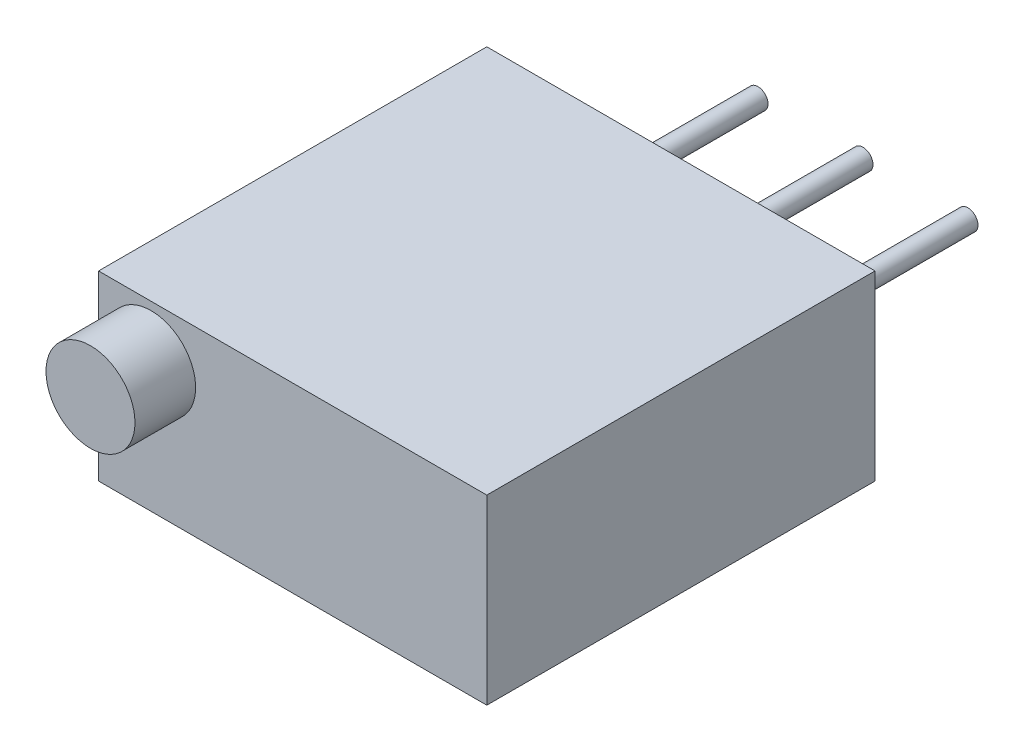
ISO-10303-21;
HEADER;
FILE_DESCRIPTION(('STEP AP214'),'2;1');
FILE_NAME('part.step','',(''),(''),'','','');
FILE_SCHEMA(('AUTOMOTIVE_DESIGN { 1 0 10303 214 1 1 1 1 }'));
ENDSEC;
DATA;
#1=APPLICATION_CONTEXT('core data for automotive mechanical design processes');
#2=APPLICATION_PROTOCOL_DEFINITION('international standard','automotive_design',2000,#1);
#3=PRODUCT_CONTEXT('',#1,'mechanical');
#4=PRODUCT('Part','Part','',(#3));
#5=PRODUCT_RELATED_PRODUCT_CATEGORY('part','',(#4));
#6=PRODUCT_DEFINITION_FORMATION('','',#4);
#7=PRODUCT_DEFINITION_CONTEXT('part definition',#1,'design');
#8=PRODUCT_DEFINITION('design','',#6,#7);
#9=PRODUCT_DEFINITION_SHAPE('','',#8);
#10=(LENGTH_UNIT() NAMED_UNIT(*) SI_UNIT(.MILLI.,.METRE.));
#11=(NAMED_UNIT(*) PLANE_ANGLE_UNIT() SI_UNIT($,.RADIAN.));
#12=(NAMED_UNIT(*) SI_UNIT($,.STERADIAN.) SOLID_ANGLE_UNIT());
#13=UNCERTAINTY_MEASURE_WITH_UNIT(LENGTH_MEASURE(1.E-05),#10,'distance_accuracy_value','');
#14=(GEOMETRIC_REPRESENTATION_CONTEXT(3) GLOBAL_UNCERTAINTY_ASSIGNED_CONTEXT((#13)) GLOBAL_UNIT_ASSIGNED_CONTEXT((#10,
#11,#12)) REPRESENTATION_CONTEXT('',''));
#15=CARTESIAN_POINT('',(0.,0.,0.));
#16=DIRECTION('',(0.,0.,1.));
#17=DIRECTION('',(1.,0.,0.));
#18=AXIS2_PLACEMENT_3D('',#15,#16,#17);
#19=CARTESIAN_POINT('',(-4.79999999999999,4.5,4.79999999999999));
#20=DIRECTION('',(0.,0.,-1.));
#21=DIRECTION('',(-1.,0.,0.));
#22=AXIS2_PLACEMENT_3D('',#19,#20,#21);
#23=PLANE('',#22);
#24=DIRECTION('',(1.,0.,0.));
#25=VECTOR('',#24,1.);
#26=CARTESIAN_POINT('',(-4.79999999999999,0.,4.79999999999999));
#27=LINE('',#26,#25);
#28=CARTESIAN_POINT('',(-4.79999999999999,0.,4.79999999999999));
#29=VERTEX_POINT('',#28);
#30=CARTESIAN_POINT('',(4.80000000000001,0.,4.79999999999999));
#31=VERTEX_POINT('',#30);
#32=EDGE_CURVE('E78',#29,#31,#27,.T.);
#33=ORIENTED_EDGE('',*,*,#32,.T.);
#34=DIRECTION('',(0.,-1.,0.));
#35=VECTOR('',#34,1.);
#36=CARTESIAN_POINT('',(4.80000000000001,4.5,4.79999999999999));
#37=LINE('',#36,#35);
#38=CARTESIAN_POINT('',(4.80000000000001,4.5,4.79999999999999));
#39=VERTEX_POINT('',#38);
#40=EDGE_CURVE('E96',#39,#31,#37,.T.);
#41=ORIENTED_EDGE('',*,*,#40,.F.);
#42=DIRECTION('',(1.,0.,0.));
#43=VECTOR('',#42,1.);
#44=CARTESIAN_POINT('',(-4.79999999999999,4.5,4.79999999999999));
#45=LINE('',#44,#43);
#46=CARTESIAN_POINT('',(-4.79999999999999,4.5,4.79999999999999));
#47=VERTEX_POINT('',#46);
#48=EDGE_CURVE('E92',#47,#39,#45,.T.);
#49=ORIENTED_EDGE('',*,*,#48,.F.);
#50=DIRECTION('',(0.,-1.,0.));
#51=VECTOR('',#50,1.);
#52=CARTESIAN_POINT('',(-4.79999999999999,4.5,4.79999999999999));
#53=LINE('',#52,#51);
#54=EDGE_CURVE('E90',#47,#29,#53,.T.);
#55=ORIENTED_EDGE('',*,*,#54,.T.);
#56=EDGE_LOOP('',(#33,#41,#49,#55));
#57=FACE_BOUND('',#56,.T.);
#58=CARTESIAN_POINT('',(-3.49999999999999,3.2,4.79999999999999));
#59=DIRECTION('',(0.,0.,-1.));
#60=DIRECTION('',(-1.,0.,0.));
#61=AXIS2_PLACEMENT_3D('',#58,#59,#60);
#62=CIRCLE('',#61,1.1);
#63=CARTESIAN_POINT('',(-4.59999999999999,3.2,4.79999999999999));
#64=VERTEX_POINT('',#63);
#65=EDGE_CURVE('E11',#64,#64,#62,.F.);
#66=ORIENTED_EDGE('',*,*,#65,.F.);
#67=EDGE_LOOP('',(#66));
#68=FACE_BOUND('',#67,.T.);
#69=ADVANCED_FACE('F37',(#57,#68),#23,.F.);
#70=CARTESIAN_POINT('',(-4.79999999999999,4.5,-4.80000000000001));
#71=DIRECTION('',(0.,0.,1.));
#72=DIRECTION('',(1.,0.,0.));
#73=AXIS2_PLACEMENT_3D('',#70,#71,#72);
#74=PLANE('',#73);
#75=CARTESIAN_POINT('',(-2.59597838181529,2.25,-4.80000000000001));
#76=DIRECTION('',(0.,0.,1.));
#77=DIRECTION('',(1.,0.,0.));
#78=AXIS2_PLACEMENT_3D('',#75,#76,#77);
#79=CIRCLE('',#78,0.25);
#80=CARTESIAN_POINT('',(-2.34597838181529,2.25,-4.80000000000001));
#81=VERTEX_POINT('',#80);
#82=EDGE_CURVE('E122',#81,#81,#79,.F.);
#83=ORIENTED_EDGE('',*,*,#82,.F.);
#84=EDGE_LOOP('',(#83));
#85=FACE_BOUND('',#84,.T.);
#86=DIRECTION('',(-1.,0.,0.));
#87=VECTOR('',#86,1.);
#88=CARTESIAN_POINT('',(-4.79999999999999,0.,-4.80000000000001));
#89=LINE('',#88,#87);
#90=CARTESIAN_POINT('',(4.80000000000001,0.,-4.80000000000001));
#91=VERTEX_POINT('',#90);
#92=CARTESIAN_POINT('',(-4.79999999999999,0.,-4.80000000000001));
#93=VERTEX_POINT('',#92);
#94=EDGE_CURVE('E108',#91,#93,#89,.T.);
#95=ORIENTED_EDGE('',*,*,#94,.T.);
#96=DIRECTION('',(0.,-1.,0.));
#97=VECTOR('',#96,1.);
#98=CARTESIAN_POINT('',(-4.79999999999999,4.5,-4.80000000000001));
#99=LINE('',#98,#97);
#100=CARTESIAN_POINT('',(-4.79999999999999,4.5,-4.80000000000001));
#101=VERTEX_POINT('',#100);
#102=EDGE_CURVE('E99',#101,#93,#99,.T.);
#103=ORIENTED_EDGE('',*,*,#102,.F.);
#104=DIRECTION('',(-1.,0.,0.));
#105=VECTOR('',#104,1.);
#106=CARTESIAN_POINT('',(-4.79999999999999,4.5,-4.80000000000001));
#107=LINE('',#106,#105);
#108=CARTESIAN_POINT('',(4.80000000000001,4.5,-4.80000000000001));
#109=VERTEX_POINT('',#108);
#110=EDGE_CURVE('E52',#109,#101,#107,.T.);
#111=ORIENTED_EDGE('',*,*,#110,.F.);
#112=DIRECTION('',(0.,-1.,0.));
#113=VECTOR('',#112,1.);
#114=CARTESIAN_POINT('',(4.80000000000001,4.5,-4.80000000000001));
#115=LINE('',#114,#113);
#116=EDGE_CURVE('E116',#109,#91,#115,.T.);
#117=ORIENTED_EDGE('',*,*,#116,.T.);
#118=EDGE_LOOP('',(#95,#103,#111,#117));
#119=FACE_BOUND('',#118,.T.);
#120=CARTESIAN_POINT('',(0.,2.25,-4.80000000000001));
#121=DIRECTION('',(0.,0.,1.));
#122=DIRECTION('',(1.,0.,0.));
#123=AXIS2_PLACEMENT_3D('',#120,#121,#122);
#124=CIRCLE('',#123,0.25);
#125=CARTESIAN_POINT('',(0.250000000000008,2.25,-4.80000000000001));
#126=VERTEX_POINT('',#125);
#127=EDGE_CURVE('E95',#126,#126,#124,.F.);
#128=ORIENTED_EDGE('',*,*,#127,.F.);
#129=EDGE_LOOP('',(#128));
#130=FACE_BOUND('',#129,.T.);
#131=CARTESIAN_POINT('',(2.5959783818153,2.25,-4.80000000000001));
#132=DIRECTION('',(0.,0.,1.));
#133=DIRECTION('',(1.,0.,0.));
#134=AXIS2_PLACEMENT_3D('',#131,#132,#133);
#135=CIRCLE('',#134,0.25);
#136=CARTESIAN_POINT('',(2.8459783818153,2.25,-4.80000000000001));
#137=VERTEX_POINT('',#136);
#138=EDGE_CURVE('E45',#137,#137,#135,.F.);
#139=ORIENTED_EDGE('',*,*,#138,.F.);
#140=EDGE_LOOP('',(#139));
#141=FACE_BOUND('',#140,.T.);
#142=ADVANCED_FACE('F129',(#85,#119,#130,#141),#74,.F.);
#143=CARTESIAN_POINT('',(-4.79999999999999,4.5,-4.80000000000001));
#144=DIRECTION('',(1.,0.,0.));
#145=DIRECTION('',(0.,0.,-1.));
#146=AXIS2_PLACEMENT_3D('',#143,#144,#145);
#147=PLANE('',#146);
#148=DIRECTION('',(0.,0.,1.));
#149=VECTOR('',#148,1.);
#150=CARTESIAN_POINT('',(-4.79999999999999,0.,-4.80000000000001));
#151=LINE('',#150,#149);
#152=EDGE_CURVE('E83',#93,#29,#151,.T.);
#153=ORIENTED_EDGE('',*,*,#152,.T.);
#154=ORIENTED_EDGE('',*,*,#54,.F.);
#155=DIRECTION('',(0.,0.,1.));
#156=VECTOR('',#155,1.);
#157=CARTESIAN_POINT('',(-4.79999999999999,4.5,-4.80000000000001));
#158=LINE('',#157,#156);
#159=EDGE_CURVE('E110',#101,#47,#158,.T.);
#160=ORIENTED_EDGE('',*,*,#159,.F.);
#161=ORIENTED_EDGE('',*,*,#102,.T.);
#162=EDGE_LOOP('',(#153,#154,#160,#161));
#163=FACE_BOUND('',#162,.T.);
#164=ADVANCED_FACE('F39',(#163),#147,.F.);
#165=CARTESIAN_POINT('',(4.80000000000001,4.5,-4.80000000000001));
#166=DIRECTION('',(-1.,0.,0.));
#167=DIRECTION('',(0.,0.,1.));
#168=AXIS2_PLACEMENT_3D('',#165,#166,#167);
#169=PLANE('',#168);
#170=DIRECTION('',(0.,0.,-1.));
#171=VECTOR('',#170,1.);
#172=CARTESIAN_POINT('',(4.80000000000001,0.,-4.80000000000001));
#173=LINE('',#172,#171);
#174=EDGE_CURVE('E84',#31,#91,#173,.T.);
#175=ORIENTED_EDGE('',*,*,#174,.T.);
#176=ORIENTED_EDGE('',*,*,#116,.F.);
#177=DIRECTION('',(0.,0.,-1.));
#178=VECTOR('',#177,1.);
#179=CARTESIAN_POINT('',(4.80000000000001,4.5,-4.80000000000001));
#180=LINE('',#179,#178);
#181=EDGE_CURVE('E57',#39,#109,#180,.T.);
#182=ORIENTED_EDGE('',*,*,#181,.F.);
#183=ORIENTED_EDGE('',*,*,#40,.T.);
#184=EDGE_LOOP('',(#175,#176,#182,#183));
#185=FACE_BOUND('',#184,.T.);
#186=ADVANCED_FACE('F137',(#185),#169,.F.);
#187=CARTESIAN_POINT('',(-4.79999999999999,4.5,-4.80000000000001));
#188=DIRECTION('',(0.,1.,0.));
#189=DIRECTION('',(0.,0.,1.));
#190=AXIS2_PLACEMENT_3D('',#187,#188,#189);
#191=PLANE('',#190);
#192=ORIENTED_EDGE('',*,*,#159,.T.);
#193=ORIENTED_EDGE('',*,*,#48,.T.);
#194=ORIENTED_EDGE('',*,*,#181,.T.);
#195=ORIENTED_EDGE('',*,*,#110,.T.);
#196=EDGE_LOOP('',(#192,#193,#194,#195));
#197=FACE_BOUND('',#196,.T.);
#198=ADVANCED_FACE('F142',(#197),#191,.T.);
#199=CARTESIAN_POINT('',(-4.79999999999999,0.,-4.80000000000001));
#200=DIRECTION('',(0.,1.,0.));
#201=DIRECTION('',(0.,0.,1.));
#202=AXIS2_PLACEMENT_3D('',#199,#200,#201);
#203=PLANE('',#202);
#204=ORIENTED_EDGE('',*,*,#152,.F.);
#205=ORIENTED_EDGE('',*,*,#94,.F.);
#206=ORIENTED_EDGE('',*,*,#174,.F.);
#207=ORIENTED_EDGE('',*,*,#32,.F.);
#208=EDGE_LOOP('',(#204,#205,#206,#207));
#209=FACE_BOUND('',#208,.T.);
#210=ADVANCED_FACE('F80',(#209),#203,.F.);
#211=CARTESIAN_POINT('',(0.,2.25,-9.3));
#212=DIRECTION('',(0.,0.,1.));
#213=DIRECTION('',(1.,0.,0.));
#214=AXIS2_PLACEMENT_3D('',#211,#212,#213);
#215=CYLINDRICAL_SURFACE('',#214,0.25);
#216=CARTESIAN_POINT('',(0.,2.25,-9.3));
#217=DIRECTION('',(0.,0.,-1.));
#218=DIRECTION('',(-1.,0.,0.));
#219=AXIS2_PLACEMENT_3D('',#216,#217,#218);
#220=CIRCLE('',#219,0.25);
#221=CARTESIAN_POINT('',(-0.249999999999992,2.25,-9.3));
#222=VERTEX_POINT('',#221);
#223=EDGE_CURVE('E100',#222,#222,#220,.T.);
#224=ORIENTED_EDGE('',*,*,#223,.F.);
#225=EDGE_LOOP('',(#224));
#226=FACE_BOUND('',#225,.T.);
#227=ORIENTED_EDGE('',*,*,#127,.T.);
#228=EDGE_LOOP('',(#227));
#229=FACE_BOUND('',#228,.T.);
#230=ADVANCED_FACE('F152',(#226,#229),#215,.T.);
#231=CARTESIAN_POINT('',(0.,2.25,-9.3));
#232=DIRECTION('',(0.,0.,-1.));
#233=DIRECTION('',(-1.,0.,0.));
#234=AXIS2_PLACEMENT_3D('',#231,#232,#233);
#235=PLANE('',#234);
#236=ORIENTED_EDGE('',*,*,#223,.T.);
#237=EDGE_LOOP('',(#236));
#238=FACE_BOUND('',#237,.T.);
#239=ADVANCED_FACE('F154',(#238),#235,.T.);
#240=CARTESIAN_POINT('',(-2.59597838181529,2.25,-9.3));
#241=DIRECTION('',(0.,0.,1.));
#242=DIRECTION('',(1.,0.,0.));
#243=AXIS2_PLACEMENT_3D('',#240,#241,#242);
#244=CYLINDRICAL_SURFACE('',#243,0.25);
#245=CARTESIAN_POINT('',(-2.59597838181529,2.25,-9.3));
#246=DIRECTION('',(0.,0.,-1.));
#247=DIRECTION('',(-1.,0.,0.));
#248=AXIS2_PLACEMENT_3D('',#245,#246,#247);
#249=CIRCLE('',#248,0.25);
#250=CARTESIAN_POINT('',(-2.84597838181529,2.25,-9.3));
#251=VERTEX_POINT('',#250);
#252=EDGE_CURVE('E103',#251,#251,#249,.T.);
#253=ORIENTED_EDGE('',*,*,#252,.F.);
#254=EDGE_LOOP('',(#253));
#255=FACE_BOUND('',#254,.T.);
#256=ORIENTED_EDGE('',*,*,#82,.T.);
#257=EDGE_LOOP('',(#256));
#258=FACE_BOUND('',#257,.T.);
#259=ADVANCED_FACE('F161',(#255,#258),#244,.T.);
#260=CARTESIAN_POINT('',(-2.59597838181529,2.25,-9.3));
#261=DIRECTION('',(0.,0.,-1.));
#262=DIRECTION('',(-1.,0.,0.));
#263=AXIS2_PLACEMENT_3D('',#260,#261,#262);
#264=PLANE('',#263);
#265=ORIENTED_EDGE('',*,*,#252,.T.);
#266=EDGE_LOOP('',(#265));
#267=FACE_BOUND('',#266,.T.);
#268=ADVANCED_FACE('F168',(#267),#264,.T.);
#269=CARTESIAN_POINT('',(2.5959783818153,2.25,-9.3));
#270=DIRECTION('',(0.,0.,1.));
#271=DIRECTION('',(1.,0.,0.));
#272=AXIS2_PLACEMENT_3D('',#269,#270,#271);
#273=CYLINDRICAL_SURFACE('',#272,0.25);
#274=CARTESIAN_POINT('',(2.5959783818153,2.25,-9.3));
#275=DIRECTION('',(0.,0.,-1.));
#276=DIRECTION('',(1.,0.,0.));
#277=AXIS2_PLACEMENT_3D('',#274,#275,#276);
#278=CIRCLE('',#277,0.25);
#279=CARTESIAN_POINT('',(2.8459783818153,2.25,-9.3));
#280=VERTEX_POINT('',#279);
#281=EDGE_CURVE('E192',#280,#280,#278,.T.);
#282=ORIENTED_EDGE('',*,*,#281,.F.);
#283=EDGE_LOOP('',(#282));
#284=FACE_BOUND('',#283,.T.);
#285=ORIENTED_EDGE('',*,*,#138,.T.);
#286=EDGE_LOOP('',(#285));
#287=FACE_BOUND('',#286,.T.);
#288=ADVANCED_FACE('F127',(#284,#287),#273,.T.);
#289=CARTESIAN_POINT('',(2.5959783818153,2.25,-9.3));
#290=DIRECTION('',(0.,0.,1.));
#291=DIRECTION('',(1.,0.,0.));
#292=AXIS2_PLACEMENT_3D('',#289,#290,#291);
#293=PLANE('',#292);
#294=ORIENTED_EDGE('',*,*,#281,.T.);
#295=EDGE_LOOP('',(#294));
#296=FACE_BOUND('',#295,.T.);
#297=ADVANCED_FACE('F175',(#296),#293,.F.);
#298=CARTESIAN_POINT('',(-3.49999999999999,3.2,6.29999999999999));
#299=DIRECTION('',(0.,0.,-1.));
#300=DIRECTION('',(-1.,0.,0.));
#301=AXIS2_PLACEMENT_3D('',#298,#299,#300);
#302=CYLINDRICAL_SURFACE('',#301,1.1);
#303=CARTESIAN_POINT('',(-3.49999999999999,3.2,6.29999999999999));
#304=DIRECTION('',(0.,0.,1.));
#305=DIRECTION('',(1.,0.,0.));
#306=AXIS2_PLACEMENT_3D('',#303,#304,#305);
#307=CIRCLE('',#306,1.1);
#308=CARTESIAN_POINT('',(-2.39999999999999,3.2,6.29999999999999));
#309=VERTEX_POINT('',#308);
#310=EDGE_CURVE('E191',#309,#309,#307,.T.);
#311=ORIENTED_EDGE('',*,*,#310,.F.);
#312=EDGE_LOOP('',(#311));
#313=FACE_BOUND('',#312,.T.);
#314=ORIENTED_EDGE('',*,*,#65,.T.);
#315=EDGE_LOOP('',(#314));
#316=FACE_BOUND('',#315,.T.);
#317=ADVANCED_FACE('F179',(#313,#316),#302,.T.);
#318=CARTESIAN_POINT('',(0.,0.,6.29999999999999));
#319=DIRECTION('',(0.,0.,1.));
#320=DIRECTION('',(1.,0.,0.));
#321=AXIS2_PLACEMENT_3D('',#318,#319,#320);
#322=PLANE('',#321);
#323=ORIENTED_EDGE('',*,*,#310,.T.);
#324=EDGE_LOOP('',(#323));
#325=FACE_BOUND('',#324,.T.);
#326=ADVANCED_FACE('F183',(#325),#322,.T.);
#327=CLOSED_SHELL('',(#69,#142,#164,#186,#198,#210,#230,#239,#259,#268,#288,#297,#317,#326));
#328=MANIFOLD_SOLID_BREP('B2',#327);
#329=ADVANCED_BREP_SHAPE_REPRESENTATION('',(#18,#328),#14);
#330=SHAPE_DEFINITION_REPRESENTATION(#9,#329);
ENDSEC;
END-ISO-10303-21;
